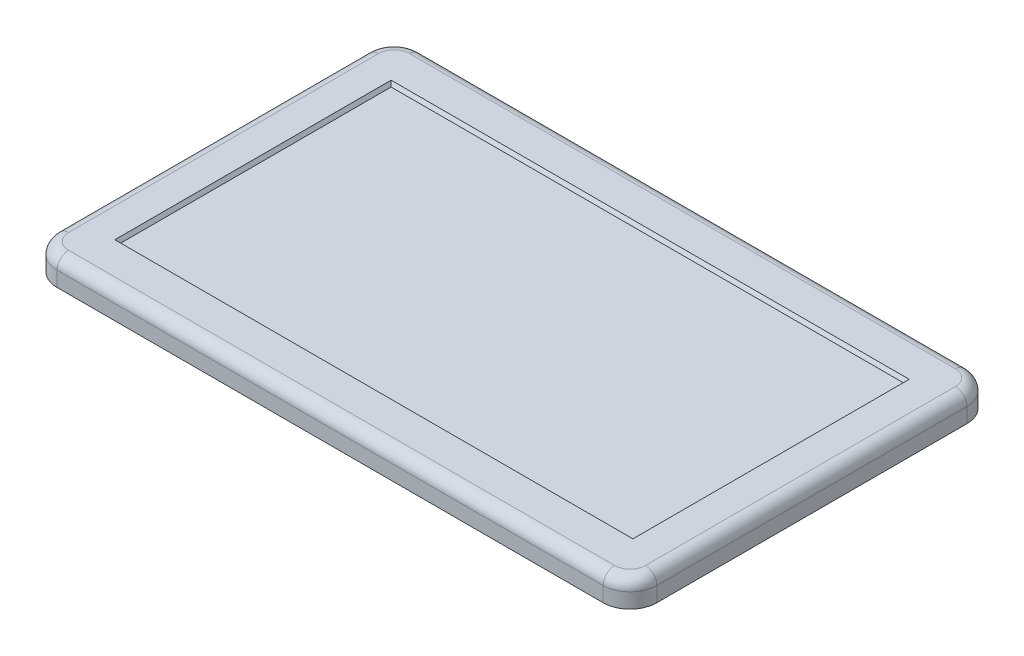
ISO-10303-21;
HEADER;
FILE_DESCRIPTION(('STEP AP214'),'2;1');
FILE_NAME('part.step','',(''),(''),'','','');
FILE_SCHEMA(('AUTOMOTIVE_DESIGN { 1 0 10303 214 1 1 1 1 }'));
ENDSEC;
DATA;
#1=APPLICATION_CONTEXT('core data for automotive mechanical design processes');
#2=APPLICATION_PROTOCOL_DEFINITION('international standard','automotive_design',2000,#1);
#3=PRODUCT_CONTEXT('',#1,'mechanical');
#4=PRODUCT('Part','Part','',(#3));
#5=PRODUCT_RELATED_PRODUCT_CATEGORY('part','',(#4));
#6=PRODUCT_DEFINITION_FORMATION('','',#4);
#7=PRODUCT_DEFINITION_CONTEXT('part definition',#1,'design');
#8=PRODUCT_DEFINITION('design','',#6,#7);
#9=PRODUCT_DEFINITION_SHAPE('','',#8);
#10=(LENGTH_UNIT() NAMED_UNIT(*) SI_UNIT(.MILLI.,.METRE.));
#11=(NAMED_UNIT(*) PLANE_ANGLE_UNIT() SI_UNIT($,.RADIAN.));
#12=(NAMED_UNIT(*) SI_UNIT($,.STERADIAN.) SOLID_ANGLE_UNIT());
#13=UNCERTAINTY_MEASURE_WITH_UNIT(LENGTH_MEASURE(1.E-05),#10,'distance_accuracy_value','');
#14=(GEOMETRIC_REPRESENTATION_CONTEXT(3) GLOBAL_UNCERTAINTY_ASSIGNED_CONTEXT((#13)) GLOBAL_UNIT_ASSIGNED_CONTEXT((#10,
#11,#12)) REPRESENTATION_CONTEXT('',''));
#15=CARTESIAN_POINT('',(0.,0.,0.));
#16=DIRECTION('',(0.,0.,1.));
#17=DIRECTION('',(1.,0.,0.));
#18=AXIS2_PLACEMENT_3D('',#15,#16,#17);
#19=CARTESIAN_POINT('',(148.6789,12.7,83.5914));
#20=DIRECTION('',(0.,1.,0.));
#21=DIRECTION('',(0.,0.,1.));
#22=AXIS2_PLACEMENT_3D('',#19,#20,#21);
#23=PLANE('',#22);
#24=CARTESIAN_POINT('',(148.6789,12.7,83.5914));
#25=DIRECTION('',(0.,-1.,0.));
#26=DIRECTION('',(0.,0.,1.));
#27=AXIS2_PLACEMENT_3D('',#24,#25,#26);
#28=CIRCLE('',#27,14.8336);
#29=CARTESIAN_POINT('',(163.5125,12.7,83.5914));
#30=VERTEX_POINT('',#29);
#31=CARTESIAN_POINT('',(148.6789,12.7,98.425));
#32=VERTEX_POINT('',#31);
#33=EDGE_CURVE('E399',#30,#32,#28,.T.);
#34=ORIENTED_EDGE('',*,*,#33,.T.);
#35=DIRECTION('',(-1.,0.,0.));
#36=VECTOR('',#35,1.);
#37=CARTESIAN_POINT('',(-148.6789,12.7,98.425));
#38=LINE('',#37,#36);
#39=CARTESIAN_POINT('',(-148.6789,12.7,98.425));
#40=VERTEX_POINT('',#39);
#41=EDGE_CURVE('E402',#32,#40,#38,.T.);
#42=ORIENTED_EDGE('',*,*,#41,.T.);
#43=CARTESIAN_POINT('',(-148.6789,12.7,83.5914));
#44=DIRECTION('',(0.,-1.,0.));
#45=DIRECTION('',(0.,0.,1.));
#46=AXIS2_PLACEMENT_3D('',#43,#44,#45);
#47=CIRCLE('',#46,14.8336);
#48=CARTESIAN_POINT('',(-163.5125,12.7,83.5914));
#49=VERTEX_POINT('',#48);
#50=EDGE_CURVE('E406',#40,#49,#47,.T.);
#51=ORIENTED_EDGE('',*,*,#50,.T.);
#52=DIRECTION('',(0.,0.,-1.));
#53=VECTOR('',#52,1.);
#54=CARTESIAN_POINT('',(-163.5125,12.7,-83.5914));
#55=LINE('',#54,#53);
#56=CARTESIAN_POINT('',(-163.5125,12.7,-83.5914));
#57=VERTEX_POINT('',#56);
#58=EDGE_CURVE('E409',#49,#57,#55,.T.);
#59=ORIENTED_EDGE('',*,*,#58,.T.);
#60=CARTESIAN_POINT('',(-148.6789,12.7,-83.5914));
#61=DIRECTION('',(0.,-1.,0.));
#62=DIRECTION('',(0.,0.,1.));
#63=AXIS2_PLACEMENT_3D('',#60,#61,#62);
#64=CIRCLE('',#63,14.8336);
#65=CARTESIAN_POINT('',(-148.6789,12.7,-98.425));
#66=VERTEX_POINT('',#65);
#67=EDGE_CURVE('E412',#57,#66,#64,.T.);
#68=ORIENTED_EDGE('',*,*,#67,.T.);
#69=DIRECTION('',(1.,0.,0.));
#70=VECTOR('',#69,1.);
#71=CARTESIAN_POINT('',(-148.6789,12.7,-98.425));
#72=LINE('',#71,#70);
#73=CARTESIAN_POINT('',(148.6789,12.7,-98.425));
#74=VERTEX_POINT('',#73);
#75=EDGE_CURVE('E415',#66,#74,#72,.T.);
#76=ORIENTED_EDGE('',*,*,#75,.T.);
#77=CARTESIAN_POINT('',(148.6789,12.7,-83.5914));
#78=DIRECTION('',(0.,-1.,0.));
#79=DIRECTION('',(0.,0.,1.));
#80=AXIS2_PLACEMENT_3D('',#77,#78,#79);
#81=CIRCLE('',#80,14.8336);
#82=CARTESIAN_POINT('',(163.5125,12.7,-83.5914));
#83=VERTEX_POINT('',#82);
#84=EDGE_CURVE('E418',#74,#83,#81,.T.);
#85=ORIENTED_EDGE('',*,*,#84,.T.);
#86=DIRECTION('',(0.,0.,1.));
#87=VECTOR('',#86,1.);
#88=CARTESIAN_POINT('',(163.5125,12.7,-83.5914));
#89=LINE('',#88,#87);
#90=EDGE_CURVE('E421',#83,#30,#89,.T.);
#91=ORIENTED_EDGE('',*,*,#90,.T.);
#92=EDGE_LOOP('',(#34,#42,#51,#59,#68,#76,#85,#91));
#93=FACE_BOUND('',#92,.T.);
#94=DIRECTION('',(0.,0.,1.));
#95=VECTOR('',#94,1.);
#96=CARTESIAN_POINT('',(145.366821734151,12.7,78.8489808004584));
#97=LINE('',#96,#95);
#98=CARTESIAN_POINT('',(145.366821734151,12.7,-78.8489808004584));
#99=VERTEX_POINT('',#98);
#100=CARTESIAN_POINT('',(145.366821734151,12.7,78.8489808004584));
#101=VERTEX_POINT('',#100);
#102=EDGE_CURVE('E225',#99,#101,#97,.T.);
#103=ORIENTED_EDGE('',*,*,#102,.F.);
#104=DIRECTION('',(1.,0.,0.));
#105=VECTOR('',#104,1.);
#106=CARTESIAN_POINT('',(-145.366821734151,12.7,-78.8489808004584));
#107=LINE('',#106,#105);
#108=CARTESIAN_POINT('',(-145.366821734151,12.7,-78.8489808004584));
#109=VERTEX_POINT('',#108);
#110=EDGE_CURVE('E227',#109,#99,#107,.T.);
#111=ORIENTED_EDGE('',*,*,#110,.F.);
#112=DIRECTION('',(0.,0.,-1.));
#113=VECTOR('',#112,1.);
#114=CARTESIAN_POINT('',(-145.366821734151,12.7,78.8489808004584));
#115=LINE('',#114,#113);
#116=CARTESIAN_POINT('',(-145.366821734151,12.7,78.8489808004584));
#117=VERTEX_POINT('',#116);
#118=EDGE_CURVE('E243',#117,#109,#115,.T.);
#119=ORIENTED_EDGE('',*,*,#118,.F.);
#120=DIRECTION('',(-1.,0.,0.));
#121=VECTOR('',#120,1.);
#122=CARTESIAN_POINT('',(-145.366821734151,12.7,78.8489808004584));
#123=LINE('',#122,#121);
#124=EDGE_CURVE('E229',#101,#117,#123,.T.);
#125=ORIENTED_EDGE('',*,*,#124,.F.);
#126=EDGE_LOOP('',(#103,#111,#119,#125));
#127=FACE_BOUND('',#126,.T.);
#128=ADVANCED_FACE('F40',(#93,#127),#23,.F.);
#129=CARTESIAN_POINT('',(150.5839,14.605,85.4964));
#130=DIRECTION('',(0.,1.,0.));
#131=DIRECTION('',(0.,0.,1.));
#132=AXIS2_PLACEMENT_3D('',#129,#130,#131);
#133=PLANE('',#132);
#134=DIRECTION('',(0.,0.,1.));
#135=VECTOR('',#134,1.);
#136=CARTESIAN_POINT('',(-159.0675,14.605,85.4964));
#137=LINE('',#136,#135);
#138=CARTESIAN_POINT('',(-159.0675,14.605,-85.4964));
#139=VERTEX_POINT('',#138);
#140=CARTESIAN_POINT('',(-159.0675,14.605,85.4964));
#141=VERTEX_POINT('',#140);
#142=EDGE_CURVE('E517',#139,#141,#137,.T.);
#143=ORIENTED_EDGE('',*,*,#142,.T.);
#144=CARTESIAN_POINT('',(-150.5839,14.605,85.4964));
#145=DIRECTION('',(0.,1.,0.));
#146=DIRECTION('',(0.,0.,1.));
#147=AXIS2_PLACEMENT_3D('',#144,#145,#146);
#148=CIRCLE('',#147,8.4836);
#149=CARTESIAN_POINT('',(-150.5839,14.605,93.98));
#150=VERTEX_POINT('',#149);
#151=EDGE_CURVE('E519',#141,#150,#148,.T.);
#152=ORIENTED_EDGE('',*,*,#151,.T.);
#153=DIRECTION('',(1.,0.,0.));
#154=VECTOR('',#153,1.);
#155=CARTESIAN_POINT('',(150.5839,14.605,93.98));
#156=LINE('',#155,#154);
#157=CARTESIAN_POINT('',(150.5839,14.605,93.98));
#158=VERTEX_POINT('',#157);
#159=EDGE_CURVE('E505',#150,#158,#156,.T.);
#160=ORIENTED_EDGE('',*,*,#159,.T.);
#161=CARTESIAN_POINT('',(150.5839,14.605,85.4964));
#162=DIRECTION('',(0.,1.,0.));
#163=DIRECTION('',(0.,0.,1.));
#164=AXIS2_PLACEMENT_3D('',#161,#162,#163);
#165=CIRCLE('',#164,8.4836);
#166=CARTESIAN_POINT('',(159.0675,14.605,85.4964));
#167=VERTEX_POINT('',#166);
#168=EDGE_CURVE('E507',#158,#167,#165,.T.);
#169=ORIENTED_EDGE('',*,*,#168,.T.);
#170=DIRECTION('',(0.,0.,-1.));
#171=VECTOR('',#170,1.);
#172=CARTESIAN_POINT('',(159.0675,14.605,-85.4964));
#173=LINE('',#172,#171);
#174=CARTESIAN_POINT('',(159.0675,14.605,-85.4964));
#175=VERTEX_POINT('',#174);
#176=EDGE_CURVE('E509',#167,#175,#173,.T.);
#177=ORIENTED_EDGE('',*,*,#176,.T.);
#178=CARTESIAN_POINT('',(150.5839,14.605,-85.4964));
#179=DIRECTION('',(0.,1.,0.));
#180=DIRECTION('',(0.,0.,1.));
#181=AXIS2_PLACEMENT_3D('',#178,#179,#180);
#182=CIRCLE('',#181,8.4836);
#183=CARTESIAN_POINT('',(150.5839,14.605,-93.98));
#184=VERTEX_POINT('',#183);
#185=EDGE_CURVE('E511',#175,#184,#182,.T.);
#186=ORIENTED_EDGE('',*,*,#185,.T.);
#187=DIRECTION('',(-1.,0.,0.));
#188=VECTOR('',#187,1.);
#189=CARTESIAN_POINT('',(-150.5839,14.605,-93.98));
#190=LINE('',#189,#188);
#191=CARTESIAN_POINT('',(-150.5839,14.605,-93.98));
#192=VERTEX_POINT('',#191);
#193=EDGE_CURVE('E513',#184,#192,#190,.T.);
#194=ORIENTED_EDGE('',*,*,#193,.T.);
#195=CARTESIAN_POINT('',(-150.5839,14.605,-85.4964));
#196=DIRECTION('',(0.,1.,0.));
#197=DIRECTION('',(0.,0.,1.));
#198=AXIS2_PLACEMENT_3D('',#195,#196,#197);
#199=CIRCLE('',#198,8.4836);
#200=EDGE_CURVE('E515',#192,#139,#199,.T.);
#201=ORIENTED_EDGE('',*,*,#200,.T.);
#202=EDGE_LOOP('',(#143,#152,#160,#169,#177,#186,#194,#201));
#203=FACE_BOUND('',#202,.T.);
#204=DIRECTION('',(1.,0.,0.));
#205=VECTOR('',#204,1.);
#206=CARTESIAN_POINT('',(-142.875,14.605,76.2));
#207=LINE('',#206,#205);
#208=CARTESIAN_POINT('',(-142.875,14.605,76.2));
#209=VERTEX_POINT('',#208);
#210=CARTESIAN_POINT('',(142.875,14.605,76.2));
#211=VERTEX_POINT('',#210);
#212=EDGE_CURVE('E263',#209,#211,#207,.T.);
#213=ORIENTED_EDGE('',*,*,#212,.F.);
#214=DIRECTION('',(0.,0.,1.));
#215=VECTOR('',#214,1.);
#216=CARTESIAN_POINT('',(-142.875,14.605,76.2));
#217=LINE('',#216,#215);
#218=CARTESIAN_POINT('',(-142.875,14.605,-76.1999999999999));
#219=VERTEX_POINT('',#218);
#220=EDGE_CURVE('E330',#219,#209,#217,.T.);
#221=ORIENTED_EDGE('',*,*,#220,.F.);
#222=DIRECTION('',(-1.,0.,0.));
#223=VECTOR('',#222,1.);
#224=CARTESIAN_POINT('',(-142.875,14.605,-76.2));
#225=LINE('',#224,#223);
#226=CARTESIAN_POINT('',(142.875,14.605,-76.2));
#227=VERTEX_POINT('',#226);
#228=EDGE_CURVE('E331',#227,#219,#225,.T.);
#229=ORIENTED_EDGE('',*,*,#228,.F.);
#230=DIRECTION('',(0.,0.,-1.));
#231=VECTOR('',#230,1.);
#232=CARTESIAN_POINT('',(142.875,14.605,76.2));
#233=LINE('',#232,#231);
#234=EDGE_CURVE('E242',#211,#227,#233,.T.);
#235=ORIENTED_EDGE('',*,*,#234,.F.);
#236=EDGE_LOOP('',(#213,#221,#229,#235));
#237=FACE_BOUND('',#236,.T.);
#238=ADVANCED_FACE('F356',(#203,#237),#133,.T.);
#239=CARTESIAN_POINT('',(150.5839,14.605,85.4964));
#240=DIRECTION('',(0.,-1.,0.));
#241=DIRECTION('',(0.,0.,-1.));
#242=AXIS2_PLACEMENT_3D('',#239,#240,#241);
#243=CYLINDRICAL_SURFACE('',#242,14.8336);
#244=DIRECTION('',(0.,-1.,0.));
#245=VECTOR('',#244,1.);
#246=CARTESIAN_POINT('',(165.4175,14.605,85.4964));
#247=LINE('',#246,#245);
#248=CARTESIAN_POINT('',(165.4175,8.255,85.4964));
#249=VERTEX_POINT('',#248);
#250=CARTESIAN_POINT('',(165.4175,0.,85.4964));
#251=VERTEX_POINT('',#250);
#252=EDGE_CURVE('E503',#249,#251,#247,.T.);
#253=ORIENTED_EDGE('',*,*,#252,.F.);
#254=CARTESIAN_POINT('',(150.5839,8.255,85.4964));
#255=DIRECTION('',(0.,1.,0.));
#256=DIRECTION('',(0.,0.,1.));
#257=AXIS2_PLACEMENT_3D('',#254,#255,#256);
#258=CIRCLE('',#257,14.8336);
#259=CARTESIAN_POINT('',(150.5839,8.255,100.33));
#260=VERTEX_POINT('',#259);
#261=EDGE_CURVE('E535',#249,#260,#258,.F.);
#262=ORIENTED_EDGE('',*,*,#261,.T.);
#263=DIRECTION('',(0.,-1.,0.));
#264=VECTOR('',#263,1.);
#265=CARTESIAN_POINT('',(150.5839,14.605,100.33));
#266=LINE('',#265,#264);
#267=CARTESIAN_POINT('',(150.5839,0.,100.33));
#268=VERTEX_POINT('',#267);
#269=EDGE_CURVE('E489',#260,#268,#266,.T.);
#270=ORIENTED_EDGE('',*,*,#269,.T.);
#271=CARTESIAN_POINT('',(150.5839,0.,85.4964));
#272=DIRECTION('',(0.,1.,0.));
#273=DIRECTION('',(0.,0.,1.));
#274=AXIS2_PLACEMENT_3D('',#271,#272,#273);
#275=CIRCLE('',#274,14.8336);
#276=EDGE_CURVE('E464',#268,#251,#275,.T.);
#277=ORIENTED_EDGE('',*,*,#276,.T.);
#278=EDGE_LOOP('',(#253,#262,#270,#277));
#279=FACE_BOUND('',#278,.T.);
#280=ADVANCED_FACE('F366',(#279),#243,.T.);
#281=CARTESIAN_POINT('',(165.4175,14.605,85.4964));
#282=DIRECTION('',(-1.,0.,0.));
#283=DIRECTION('',(0.,0.,1.));
#284=AXIS2_PLACEMENT_3D('',#281,#282,#283);
#285=PLANE('',#284);
#286=DIRECTION('',(0.,-1.,0.));
#287=VECTOR('',#286,1.);
#288=CARTESIAN_POINT('',(165.4175,14.605,-85.4964));
#289=LINE('',#288,#287);
#290=CARTESIAN_POINT('',(165.4175,8.255,-85.4964));
#291=VERTEX_POINT('',#290);
#292=CARTESIAN_POINT('',(165.4175,0.,-85.4964));
#293=VERTEX_POINT('',#292);
#294=EDGE_CURVE('E501',#291,#293,#289,.T.);
#295=ORIENTED_EDGE('',*,*,#294,.F.);
#296=DIRECTION('',(0.,0.,-1.));
#297=VECTOR('',#296,1.);
#298=CARTESIAN_POINT('',(165.4175,8.255,85.4964));
#299=LINE('',#298,#297);
#300=EDGE_CURVE('E533',#291,#249,#299,.F.);
#301=ORIENTED_EDGE('',*,*,#300,.T.);
#302=ORIENTED_EDGE('',*,*,#252,.T.);
#303=DIRECTION('',(0.,0.,-1.));
#304=VECTOR('',#303,1.);
#305=CARTESIAN_POINT('',(165.4175,0.,85.4964));
#306=LINE('',#305,#304);
#307=EDGE_CURVE('E467',#251,#293,#306,.T.);
#308=ORIENTED_EDGE('',*,*,#307,.T.);
#309=EDGE_LOOP('',(#295,#301,#302,#308));
#310=FACE_BOUND('',#309,.T.);
#311=ADVANCED_FACE('F845',(#310),#285,.F.);
#312=CARTESIAN_POINT('',(150.5839,14.605,-85.4964));
#313=DIRECTION('',(0.,-1.,0.));
#314=DIRECTION('',(0.,0.,-1.));
#315=AXIS2_PLACEMENT_3D('',#312,#313,#314);
#316=CYLINDRICAL_SURFACE('',#315,14.8336);
#317=DIRECTION('',(0.,-1.,0.));
#318=VECTOR('',#317,1.);
#319=CARTESIAN_POINT('',(150.5839,14.605,-100.33));
#320=LINE('',#319,#318);
#321=CARTESIAN_POINT('',(150.5839,8.255,-100.33));
#322=VERTEX_POINT('',#321);
#323=CARTESIAN_POINT('',(150.5839,0.,-100.33));
#324=VERTEX_POINT('',#323);
#325=EDGE_CURVE('E499',#322,#324,#320,.T.);
#326=ORIENTED_EDGE('',*,*,#325,.F.);
#327=CARTESIAN_POINT('',(150.5839,8.255,-85.4964));
#328=DIRECTION('',(0.,1.,0.));
#329=DIRECTION('',(0.,0.,1.));
#330=AXIS2_PLACEMENT_3D('',#327,#328,#329);
#331=CIRCLE('',#330,14.8336);
#332=EDGE_CURVE('E531',#322,#291,#331,.F.);
#333=ORIENTED_EDGE('',*,*,#332,.T.);
#334=ORIENTED_EDGE('',*,*,#294,.T.);
#335=CARTESIAN_POINT('',(150.5839,0.,-85.4964));
#336=DIRECTION('',(0.,1.,0.));
#337=DIRECTION('',(0.,0.,1.));
#338=AXIS2_PLACEMENT_3D('',#335,#336,#337);
#339=CIRCLE('',#338,14.8336);
#340=EDGE_CURVE('E471',#293,#324,#339,.T.);
#341=ORIENTED_EDGE('',*,*,#340,.T.);
#342=EDGE_LOOP('',(#326,#333,#334,#341));
#343=FACE_BOUND('',#342,.T.);
#344=ADVANCED_FACE('F836',(#343),#316,.T.);
#345=CARTESIAN_POINT('',(-150.5839,14.605,-100.33));
#346=DIRECTION('',(0.,0.,1.));
#347=DIRECTION('',(1.,0.,0.));
#348=AXIS2_PLACEMENT_3D('',#345,#346,#347);
#349=PLANE('',#348);
#350=DIRECTION('',(0.,-1.,0.));
#351=VECTOR('',#350,1.);
#352=CARTESIAN_POINT('',(-150.5839,14.605,-100.33));
#353=LINE('',#352,#351);
#354=CARTESIAN_POINT('',(-150.5839,8.255,-100.33));
#355=VERTEX_POINT('',#354);
#356=CARTESIAN_POINT('',(-150.5839,0.,-100.33));
#357=VERTEX_POINT('',#356);
#358=EDGE_CURVE('E497',#355,#357,#353,.T.);
#359=ORIENTED_EDGE('',*,*,#358,.F.);
#360=DIRECTION('',(-1.,0.,0.));
#361=VECTOR('',#360,1.);
#362=CARTESIAN_POINT('',(150.5839,8.255,-100.33));
#363=LINE('',#362,#361);
#364=EDGE_CURVE('E529',#355,#322,#363,.F.);
#365=ORIENTED_EDGE('',*,*,#364,.T.);
#366=ORIENTED_EDGE('',*,*,#325,.T.);
#367=DIRECTION('',(-1.,0.,0.));
#368=VECTOR('',#367,1.);
#369=CARTESIAN_POINT('',(-150.5839,0.,-100.33));
#370=LINE('',#369,#368);
#371=EDGE_CURVE('E474',#324,#357,#370,.T.);
#372=ORIENTED_EDGE('',*,*,#371,.T.);
#373=EDGE_LOOP('',(#359,#365,#366,#372));
#374=FACE_BOUND('',#373,.T.);
#375=ADVANCED_FACE('F827',(#374),#349,.F.);
#376=CARTESIAN_POINT('',(-150.5839,14.605,-85.4964));
#377=DIRECTION('',(0.,-1.,0.));
#378=DIRECTION('',(0.,0.,-1.));
#379=AXIS2_PLACEMENT_3D('',#376,#377,#378);
#380=CYLINDRICAL_SURFACE('',#379,14.8336);
#381=DIRECTION('',(0.,-1.,0.));
#382=VECTOR('',#381,1.);
#383=CARTESIAN_POINT('',(-165.4175,14.605,-85.4964));
#384=LINE('',#383,#382);
#385=CARTESIAN_POINT('',(-165.4175,8.255,-85.4964));
#386=VERTEX_POINT('',#385);
#387=CARTESIAN_POINT('',(-165.4175,0.,-85.4964));
#388=VERTEX_POINT('',#387);
#389=EDGE_CURVE('E495',#386,#388,#384,.T.);
#390=ORIENTED_EDGE('',*,*,#389,.F.);
#391=CARTESIAN_POINT('',(-150.5839,8.255,-85.4964));
#392=DIRECTION('',(0.,1.,0.));
#393=DIRECTION('',(0.,0.,1.));
#394=AXIS2_PLACEMENT_3D('',#391,#392,#393);
#395=CIRCLE('',#394,14.8336);
#396=EDGE_CURVE('E527',#386,#355,#395,.F.);
#397=ORIENTED_EDGE('',*,*,#396,.T.);
#398=ORIENTED_EDGE('',*,*,#358,.T.);
#399=CARTESIAN_POINT('',(-150.5839,0.,-85.4964));
#400=DIRECTION('',(0.,1.,0.));
#401=DIRECTION('',(0.,0.,1.));
#402=AXIS2_PLACEMENT_3D('',#399,#400,#401);
#403=CIRCLE('',#402,14.8336);
#404=EDGE_CURVE('E477',#357,#388,#403,.T.);
#405=ORIENTED_EDGE('',*,*,#404,.T.);
#406=EDGE_LOOP('',(#390,#397,#398,#405));
#407=FACE_BOUND('',#406,.T.);
#408=ADVANCED_FACE('F818',(#407),#380,.T.);
#409=CARTESIAN_POINT('',(-165.4175,14.605,85.4964));
#410=DIRECTION('',(1.,0.,0.));
#411=DIRECTION('',(0.,0.,-1.));
#412=AXIS2_PLACEMENT_3D('',#409,#410,#411);
#413=PLANE('',#412);
#414=DIRECTION('',(0.,-1.,0.));
#415=VECTOR('',#414,1.);
#416=CARTESIAN_POINT('',(-165.4175,14.605,85.4964));
#417=LINE('',#416,#415);
#418=CARTESIAN_POINT('',(-165.4175,8.255,85.4964));
#419=VERTEX_POINT('',#418);
#420=CARTESIAN_POINT('',(-165.4175,0.,85.4964));
#421=VERTEX_POINT('',#420);
#422=EDGE_CURVE('E493',#419,#421,#417,.T.);
#423=ORIENTED_EDGE('',*,*,#422,.F.);
#424=DIRECTION('',(0.,0.,1.));
#425=VECTOR('',#424,1.);
#426=CARTESIAN_POINT('',(-165.4175,8.255,-85.4964));
#427=LINE('',#426,#425);
#428=EDGE_CURVE('E525',#419,#386,#427,.F.);
#429=ORIENTED_EDGE('',*,*,#428,.T.);
#430=ORIENTED_EDGE('',*,*,#389,.T.);
#431=DIRECTION('',(0.,0.,1.));
#432=VECTOR('',#431,1.);
#433=CARTESIAN_POINT('',(-165.4175,0.,85.4964));
#434=LINE('',#433,#432);
#435=EDGE_CURVE('E480',#388,#421,#434,.T.);
#436=ORIENTED_EDGE('',*,*,#435,.T.);
#437=EDGE_LOOP('',(#423,#429,#430,#436));
#438=FACE_BOUND('',#437,.T.);
#439=ADVANCED_FACE('F809',(#438),#413,.F.);
#440=CARTESIAN_POINT('',(-150.5839,14.605,85.4964));
#441=DIRECTION('',(0.,-1.,0.));
#442=DIRECTION('',(0.,0.,-1.));
#443=AXIS2_PLACEMENT_3D('',#440,#441,#442);
#444=CYLINDRICAL_SURFACE('',#443,14.8336);
#445=DIRECTION('',(0.,-1.,0.));
#446=VECTOR('',#445,1.);
#447=CARTESIAN_POINT('',(-150.5839,14.605,100.33));
#448=LINE('',#447,#446);
#449=CARTESIAN_POINT('',(-150.5839,8.255,100.33));
#450=VERTEX_POINT('',#449);
#451=CARTESIAN_POINT('',(-150.5839,0.,100.33));
#452=VERTEX_POINT('',#451);
#453=EDGE_CURVE('E491',#450,#452,#448,.T.);
#454=ORIENTED_EDGE('',*,*,#453,.F.);
#455=CARTESIAN_POINT('',(-150.5839,8.255,85.4964));
#456=DIRECTION('',(0.,1.,0.));
#457=DIRECTION('',(0.,0.,1.));
#458=AXIS2_PLACEMENT_3D('',#455,#456,#457);
#459=CIRCLE('',#458,14.8336);
#460=EDGE_CURVE('E522',#450,#419,#459,.F.);
#461=ORIENTED_EDGE('',*,*,#460,.T.);
#462=ORIENTED_EDGE('',*,*,#422,.T.);
#463=CARTESIAN_POINT('',(-150.5839,0.,85.4964));
#464=DIRECTION('',(0.,1.,0.));
#465=DIRECTION('',(0.,0.,-1.));
#466=AXIS2_PLACEMENT_3D('',#463,#464,#465);
#467=CIRCLE('',#466,14.8336);
#468=EDGE_CURVE('E483',#421,#452,#467,.T.);
#469=ORIENTED_EDGE('',*,*,#468,.T.);
#470=EDGE_LOOP('',(#454,#461,#462,#469));
#471=FACE_BOUND('',#470,.T.);
#472=ADVANCED_FACE('F801',(#471),#444,.T.);
#473=CARTESIAN_POINT('',(-150.5839,14.605,100.33));
#474=DIRECTION('',(0.,0.,-1.));
#475=DIRECTION('',(-1.,0.,0.));
#476=AXIS2_PLACEMENT_3D('',#473,#474,#475);
#477=PLANE('',#476);
#478=ORIENTED_EDGE('',*,*,#269,.F.);
#479=DIRECTION('',(1.,0.,0.));
#480=VECTOR('',#479,1.);
#481=CARTESIAN_POINT('',(-150.5839,8.255,100.33));
#482=LINE('',#481,#480);
#483=EDGE_CURVE('E537',#260,#450,#482,.F.);
#484=ORIENTED_EDGE('',*,*,#483,.T.);
#485=ORIENTED_EDGE('',*,*,#453,.T.);
#486=DIRECTION('',(1.,0.,0.));
#487=VECTOR('',#486,1.);
#488=CARTESIAN_POINT('',(-150.5839,0.,100.33));
#489=LINE('',#488,#487);
#490=EDGE_CURVE('E486',#452,#268,#489,.T.);
#491=ORIENTED_EDGE('',*,*,#490,.T.);
#492=EDGE_LOOP('',(#478,#484,#485,#491));
#493=FACE_BOUND('',#492,.T.);
#494=ADVANCED_FACE('F795',(#493),#477,.F.);
#495=CARTESIAN_POINT('',(150.5839,0.,85.4964));
#496=DIRECTION('',(0.,1.,0.));
#497=DIRECTION('',(0.,0.,1.));
#498=AXIS2_PLACEMENT_3D('',#495,#496,#497);
#499=PLANE('',#498);
#500=DIRECTION('',(-1.,0.,0.));
#501=VECTOR('',#500,1.);
#502=CARTESIAN_POINT('',(-148.6789,0.,98.425));
#503=LINE('',#502,#501);
#504=CARTESIAN_POINT('',(148.6789,0.,98.425));
#505=VERTEX_POINT('',#504);
#506=CARTESIAN_POINT('',(-148.6789,0.,98.425));
#507=VERTEX_POINT('',#506);
#508=EDGE_CURVE('E427',#505,#507,#503,.T.);
#509=ORIENTED_EDGE('',*,*,#508,.F.);
#510=CARTESIAN_POINT('',(148.6789,0.,83.5914));
#511=DIRECTION('',(0.,-1.,0.));
#512=DIRECTION('',(0.,0.,1.));
#513=AXIS2_PLACEMENT_3D('',#510,#511,#512);
#514=CIRCLE('',#513,14.8336);
#515=CARTESIAN_POINT('',(163.5125,0.,83.5914));
#516=VERTEX_POINT('',#515);
#517=EDGE_CURVE('E425',#516,#505,#514,.T.);
#518=ORIENTED_EDGE('',*,*,#517,.F.);
#519=DIRECTION('',(0.,0.,1.));
#520=VECTOR('',#519,1.);
#521=CARTESIAN_POINT('',(163.5125,0.,-83.5914));
#522=LINE('',#521,#520);
#523=CARTESIAN_POINT('',(163.5125,0.,-83.5914));
#524=VERTEX_POINT('',#523);
#525=EDGE_CURVE('E403',#524,#516,#522,.T.);
#526=ORIENTED_EDGE('',*,*,#525,.F.);
#527=CARTESIAN_POINT('',(148.6789,0.,-83.5914));
#528=DIRECTION('',(0.,-1.,0.));
#529=DIRECTION('',(0.,0.,1.));
#530=AXIS2_PLACEMENT_3D('',#527,#528,#529);
#531=CIRCLE('',#530,14.8336);
#532=CARTESIAN_POINT('',(148.6789,0.,-98.425));
#533=VERTEX_POINT('',#532);
#534=EDGE_CURVE('E442',#533,#524,#531,.T.);
#535=ORIENTED_EDGE('',*,*,#534,.F.);
#536=DIRECTION('',(1.,0.,0.));
#537=VECTOR('',#536,1.);
#538=CARTESIAN_POINT('',(-148.6789,0.,-98.425));
#539=LINE('',#538,#537);
#540=CARTESIAN_POINT('',(-148.6789,0.,-98.425));
#541=VERTEX_POINT('',#540);
#542=EDGE_CURVE('E439',#541,#533,#539,.T.);
#543=ORIENTED_EDGE('',*,*,#542,.F.);
#544=CARTESIAN_POINT('',(-148.6789,0.,-83.5914));
#545=DIRECTION('',(0.,-1.,0.));
#546=DIRECTION('',(0.,0.,1.));
#547=AXIS2_PLACEMENT_3D('',#544,#545,#546);
#548=CIRCLE('',#547,14.8336);
#549=CARTESIAN_POINT('',(-163.5125,0.,-83.5914));
#550=VERTEX_POINT('',#549);
#551=EDGE_CURVE('E436',#550,#541,#548,.T.);
#552=ORIENTED_EDGE('',*,*,#551,.F.);
#553=DIRECTION('',(0.,0.,-1.));
#554=VECTOR('',#553,1.);
#555=CARTESIAN_POINT('',(-163.5125,0.,-83.5914));
#556=LINE('',#555,#554);
#557=CARTESIAN_POINT('',(-163.5125,0.,83.5914));
#558=VERTEX_POINT('',#557);
#559=EDGE_CURVE('E433',#558,#550,#556,.T.);
#560=ORIENTED_EDGE('',*,*,#559,.F.);
#561=CARTESIAN_POINT('',(-148.6789,0.,83.5914));
#562=DIRECTION('',(0.,-1.,0.));
#563=DIRECTION('',(0.,0.,1.));
#564=AXIS2_PLACEMENT_3D('',#561,#562,#563);
#565=CIRCLE('',#564,14.8336);
#566=EDGE_CURVE('E430',#507,#558,#565,.T.);
#567=ORIENTED_EDGE('',*,*,#566,.F.);
#568=EDGE_LOOP('',(#509,#518,#526,#535,#543,#552,#560,#567));
#569=FACE_BOUND('',#568,.T.);
#570=ORIENTED_EDGE('',*,*,#276,.F.);
#571=ORIENTED_EDGE('',*,*,#490,.F.);
#572=ORIENTED_EDGE('',*,*,#468,.F.);
#573=ORIENTED_EDGE('',*,*,#435,.F.);
#574=ORIENTED_EDGE('',*,*,#404,.F.);
#575=ORIENTED_EDGE('',*,*,#371,.F.);
#576=ORIENTED_EDGE('',*,*,#340,.F.);
#577=ORIENTED_EDGE('',*,*,#307,.F.);
#578=EDGE_LOOP('',(#570,#571,#572,#573,#574,#575,#576,#577));
#579=FACE_BOUND('',#578,.T.);
#580=ADVANCED_FACE('F370',(#569,#579),#499,.F.);
#581=CARTESIAN_POINT('',(150.5839,8.255,-85.4964));
#582=DIRECTION('',(0.,1.,0.));
#583=DIRECTION('',(0.,0.,1.));
#584=AXIS2_PLACEMENT_3D('',#581,#582,#583);
#585=TOROIDAL_SURFACE('',#584,8.4836,6.35);
#586=CARTESIAN_POINT('',(159.0675,8.255,-85.4964));
#587=DIRECTION('',(0.,0.,1.));
#588=DIRECTION('',(1.,0.,0.));
#589=AXIS2_PLACEMENT_3D('',#586,#587,#588);
#590=CIRCLE('',#589,6.35);
#591=EDGE_CURVE('E555',#291,#175,#590,.T.);
#592=ORIENTED_EDGE('',*,*,#591,.F.);
#593=ORIENTED_EDGE('',*,*,#332,.F.);
#594=CARTESIAN_POINT('',(150.5839,8.255,-93.98));
#595=DIRECTION('',(-1.,0.,0.));
#596=DIRECTION('',(0.,0.,1.));
#597=AXIS2_PLACEMENT_3D('',#594,#595,#596);
#598=CIRCLE('',#597,6.35);
#599=EDGE_CURVE('E468',#184,#322,#598,.T.);
#600=ORIENTED_EDGE('',*,*,#599,.F.);
#601=ORIENTED_EDGE('',*,*,#185,.F.);
#602=EDGE_LOOP('',(#592,#593,#600,#601));
#603=FACE_BOUND('',#602,.T.);
#604=ADVANCED_FACE('F657',(#603),#585,.T.);
#605=CARTESIAN_POINT('',(150.5839,8.255,-93.98));
#606=DIRECTION('',(1.,0.,0.));
#607=DIRECTION('',(0.,0.,-1.));
#608=AXIS2_PLACEMENT_3D('',#605,#606,#607);
#609=CYLINDRICAL_SURFACE('',#608,6.35);
#610=ORIENTED_EDGE('',*,*,#599,.T.);
#611=ORIENTED_EDGE('',*,*,#364,.F.);
#612=CARTESIAN_POINT('',(-150.5839,8.255,-93.98));
#613=DIRECTION('',(-1.,0.,0.));
#614=DIRECTION('',(0.,0.,1.));
#615=AXIS2_PLACEMENT_3D('',#612,#613,#614);
#616=CIRCLE('',#615,6.35);
#617=EDGE_CURVE('E552',#192,#355,#616,.T.);
#618=ORIENTED_EDGE('',*,*,#617,.F.);
#619=ORIENTED_EDGE('',*,*,#193,.F.);
#620=EDGE_LOOP('',(#610,#611,#618,#619));
#621=FACE_BOUND('',#620,.T.);
#622=ADVANCED_FACE('F653',(#621),#609,.T.);
#623=CARTESIAN_POINT('',(159.0675,8.255,85.4964));
#624=DIRECTION('',(0.,0.,1.));
#625=DIRECTION('',(1.,0.,0.));
#626=AXIS2_PLACEMENT_3D('',#623,#624,#625);
#627=CYLINDRICAL_SURFACE('',#626,6.35);
#628=ORIENTED_EDGE('',*,*,#591,.T.);
#629=ORIENTED_EDGE('',*,*,#176,.F.);
#630=CARTESIAN_POINT('',(159.0675,8.255,85.4964));
#631=DIRECTION('',(0.,0.,1.));
#632=DIRECTION('',(1.,0.,0.));
#633=AXIS2_PLACEMENT_3D('',#630,#631,#632);
#634=CIRCLE('',#633,6.35);
#635=EDGE_CURVE('E549',#249,#167,#634,.T.);
#636=ORIENTED_EDGE('',*,*,#635,.F.);
#637=ORIENTED_EDGE('',*,*,#300,.F.);
#638=EDGE_LOOP('',(#628,#629,#636,#637));
#639=FACE_BOUND('',#638,.T.);
#640=ADVANCED_FACE('F649',(#639),#627,.T.);
#641=CARTESIAN_POINT('',(-150.5839,8.255,-85.4964));
#642=DIRECTION('',(0.,1.,0.));
#643=DIRECTION('',(0.,0.,1.));
#644=AXIS2_PLACEMENT_3D('',#641,#642,#643);
#645=TOROIDAL_SURFACE('',#644,8.4836,6.35);
#646=ORIENTED_EDGE('',*,*,#617,.T.);
#647=ORIENTED_EDGE('',*,*,#396,.F.);
#648=CARTESIAN_POINT('',(-159.0675,8.255,-85.4964));
#649=DIRECTION('',(0.,0.,1.));
#650=DIRECTION('',(1.,0.,0.));
#651=AXIS2_PLACEMENT_3D('',#648,#649,#650);
#652=CIRCLE('',#651,6.35);
#653=EDGE_CURVE('E546',#139,#386,#652,.T.);
#654=ORIENTED_EDGE('',*,*,#653,.F.);
#655=ORIENTED_EDGE('',*,*,#200,.F.);
#656=EDGE_LOOP('',(#646,#647,#654,#655));
#657=FACE_BOUND('',#656,.T.);
#658=ADVANCED_FACE('F645',(#657),#645,.T.);
#659=CARTESIAN_POINT('',(150.5839,8.255,85.4964));
#660=DIRECTION('',(0.,1.,0.));
#661=DIRECTION('',(0.,0.,1.));
#662=AXIS2_PLACEMENT_3D('',#659,#660,#661);
#663=TOROIDAL_SURFACE('',#662,8.4836,6.35);
#664=ORIENTED_EDGE('',*,*,#635,.T.);
#665=ORIENTED_EDGE('',*,*,#168,.F.);
#666=CARTESIAN_POINT('',(150.5839,8.255,93.98));
#667=DIRECTION('',(-1.,0.,0.));
#668=DIRECTION('',(0.,0.,1.));
#669=AXIS2_PLACEMENT_3D('',#666,#667,#668);
#670=CIRCLE('',#669,6.35);
#671=EDGE_CURVE('E543',#260,#158,#670,.T.);
#672=ORIENTED_EDGE('',*,*,#671,.F.);
#673=ORIENTED_EDGE('',*,*,#261,.F.);
#674=EDGE_LOOP('',(#664,#665,#672,#673));
#675=FACE_BOUND('',#674,.T.);
#676=ADVANCED_FACE('F641',(#675),#663,.T.);
#677=CARTESIAN_POINT('',(-159.0675,8.255,85.4964));
#678=DIRECTION('',(0.,0.,-1.));
#679=DIRECTION('',(-1.,0.,0.));
#680=AXIS2_PLACEMENT_3D('',#677,#678,#679);
#681=CYLINDRICAL_SURFACE('',#680,6.35);
#682=ORIENTED_EDGE('',*,*,#653,.T.);
#683=ORIENTED_EDGE('',*,*,#428,.F.);
#684=CARTESIAN_POINT('',(-159.0675,8.255,85.4964));
#685=DIRECTION('',(0.,0.,1.));
#686=DIRECTION('',(1.,0.,0.));
#687=AXIS2_PLACEMENT_3D('',#684,#685,#686);
#688=CIRCLE('',#687,6.35);
#689=EDGE_CURVE('E541',#141,#419,#688,.T.);
#690=ORIENTED_EDGE('',*,*,#689,.F.);
#691=ORIENTED_EDGE('',*,*,#142,.F.);
#692=EDGE_LOOP('',(#682,#683,#690,#691));
#693=FACE_BOUND('',#692,.T.);
#694=ADVANCED_FACE('F633',(#693),#681,.T.);
#695=CARTESIAN_POINT('',(150.5839,8.255,93.98));
#696=DIRECTION('',(-1.,0.,0.));
#697=DIRECTION('',(0.,0.,1.));
#698=AXIS2_PLACEMENT_3D('',#695,#696,#697);
#699=CYLINDRICAL_SURFACE('',#698,6.35);
#700=ORIENTED_EDGE('',*,*,#671,.T.);
#701=ORIENTED_EDGE('',*,*,#159,.F.);
#702=CARTESIAN_POINT('',(-150.5839,8.255,93.98));
#703=DIRECTION('',(-1.,0.,0.));
#704=DIRECTION('',(0.,0.,1.));
#705=AXIS2_PLACEMENT_3D('',#702,#703,#704);
#706=CIRCLE('',#705,6.35);
#707=EDGE_CURVE('E449',#450,#150,#706,.T.);
#708=ORIENTED_EDGE('',*,*,#707,.F.);
#709=ORIENTED_EDGE('',*,*,#483,.F.);
#710=EDGE_LOOP('',(#700,#701,#708,#709));
#711=FACE_BOUND('',#710,.T.);
#712=ADVANCED_FACE('F627',(#711),#699,.T.);
#713=CARTESIAN_POINT('',(-150.5839,8.255,85.4964));
#714=DIRECTION('',(0.,1.,0.));
#715=DIRECTION('',(0.,0.,1.));
#716=AXIS2_PLACEMENT_3D('',#713,#714,#715);
#717=TOROIDAL_SURFACE('',#716,8.4836,6.35);
#718=ORIENTED_EDGE('',*,*,#689,.T.);
#719=ORIENTED_EDGE('',*,*,#460,.F.);
#720=ORIENTED_EDGE('',*,*,#707,.T.);
#721=ORIENTED_EDGE('',*,*,#151,.F.);
#722=EDGE_LOOP('',(#718,#719,#720,#721));
#723=FACE_BOUND('',#722,.T.);
#724=ADVANCED_FACE('F623',(#723),#717,.T.);
#725=CARTESIAN_POINT('',(148.6789,12.7,83.5914));
#726=DIRECTION('',(0.,-1.,0.));
#727=DIRECTION('',(0.,0.,-1.));
#728=AXIS2_PLACEMENT_3D('',#725,#726,#727);
#729=CYLINDRICAL_SURFACE('',#728,14.8336);
#730=ORIENTED_EDGE('',*,*,#517,.T.);
#731=DIRECTION('',(0.,-1.,0.));
#732=VECTOR('',#731,1.);
#733=CARTESIAN_POINT('',(148.6789,12.7,98.425));
#734=LINE('',#733,#732);
#735=EDGE_CURVE('E424',#32,#505,#734,.T.);
#736=ORIENTED_EDGE('',*,*,#735,.F.);
#737=ORIENTED_EDGE('',*,*,#33,.F.);
#738=DIRECTION('',(0.,-1.,0.));
#739=VECTOR('',#738,1.);
#740=CARTESIAN_POINT('',(163.5125,12.7,83.5914));
#741=LINE('',#740,#739);
#742=EDGE_CURVE('E447',#30,#516,#741,.T.);
#743=ORIENTED_EDGE('',*,*,#742,.T.);
#744=EDGE_LOOP('',(#730,#736,#737,#743));
#745=FACE_BOUND('',#744,.T.);
#746=ADVANCED_FACE('F368',(#745),#729,.F.);
#747=CARTESIAN_POINT('',(163.5125,12.7,-83.5914));
#748=DIRECTION('',(1.,0.,0.));
#749=DIRECTION('',(0.,0.,-1.));
#750=AXIS2_PLACEMENT_3D('',#747,#748,#749);
#751=PLANE('',#750);
#752=ORIENTED_EDGE('',*,*,#525,.T.);
#753=ORIENTED_EDGE('',*,*,#742,.F.);
#754=ORIENTED_EDGE('',*,*,#90,.F.);
#755=DIRECTION('',(0.,-1.,0.));
#756=VECTOR('',#755,1.);
#757=CARTESIAN_POINT('',(163.5125,12.7,-83.5914));
#758=LINE('',#757,#756);
#759=EDGE_CURVE('E450',#83,#524,#758,.T.);
#760=ORIENTED_EDGE('',*,*,#759,.T.);
#761=EDGE_LOOP('',(#752,#753,#754,#760));
#762=FACE_BOUND('',#761,.T.);
#763=ADVANCED_FACE('F574',(#762),#751,.F.);
#764=CARTESIAN_POINT('',(148.6789,12.7,-83.5914));
#765=DIRECTION('',(0.,-1.,0.));
#766=DIRECTION('',(0.,0.,-1.));
#767=AXIS2_PLACEMENT_3D('',#764,#765,#766);
#768=CYLINDRICAL_SURFACE('',#767,14.8336);
#769=ORIENTED_EDGE('',*,*,#534,.T.);
#770=ORIENTED_EDGE('',*,*,#759,.F.);
#771=ORIENTED_EDGE('',*,*,#84,.F.);
#772=DIRECTION('',(0.,-1.,0.));
#773=VECTOR('',#772,1.);
#774=CARTESIAN_POINT('',(148.6789,12.7,-98.425));
#775=LINE('',#774,#773);
#776=EDGE_CURVE('E452',#74,#533,#775,.T.);
#777=ORIENTED_EDGE('',*,*,#776,.T.);
#778=EDGE_LOOP('',(#769,#770,#771,#777));
#779=FACE_BOUND('',#778,.T.);
#780=ADVANCED_FACE('F577',(#779),#768,.F.);
#781=CARTESIAN_POINT('',(-148.6789,12.7,-98.425));
#782=DIRECTION('',(0.,0.,-1.));
#783=DIRECTION('',(-1.,0.,0.));
#784=AXIS2_PLACEMENT_3D('',#781,#782,#783);
#785=PLANE('',#784);
#786=ORIENTED_EDGE('',*,*,#542,.T.);
#787=ORIENTED_EDGE('',*,*,#776,.F.);
#788=ORIENTED_EDGE('',*,*,#75,.F.);
#789=DIRECTION('',(0.,-1.,0.));
#790=VECTOR('',#789,1.);
#791=CARTESIAN_POINT('',(-148.6789,12.7,-98.425));
#792=LINE('',#791,#790);
#793=EDGE_CURVE('E454',#66,#541,#792,.T.);
#794=ORIENTED_EDGE('',*,*,#793,.T.);
#795=EDGE_LOOP('',(#786,#787,#788,#794));
#796=FACE_BOUND('',#795,.T.);
#797=ADVANCED_FACE('F581',(#796),#785,.F.);
#798=CARTESIAN_POINT('',(-148.6789,12.7,-83.5914));
#799=DIRECTION('',(0.,-1.,0.));
#800=DIRECTION('',(0.,0.,-1.));
#801=AXIS2_PLACEMENT_3D('',#798,#799,#800);
#802=CYLINDRICAL_SURFACE('',#801,14.8336);
#803=ORIENTED_EDGE('',*,*,#551,.T.);
#804=ORIENTED_EDGE('',*,*,#793,.F.);
#805=ORIENTED_EDGE('',*,*,#67,.F.);
#806=DIRECTION('',(0.,-1.,0.));
#807=VECTOR('',#806,1.);
#808=CARTESIAN_POINT('',(-163.5125,12.7,-83.5914));
#809=LINE('',#808,#807);
#810=EDGE_CURVE('E456',#57,#550,#809,.T.);
#811=ORIENTED_EDGE('',*,*,#810,.T.);
#812=EDGE_LOOP('',(#803,#804,#805,#811));
#813=FACE_BOUND('',#812,.T.);
#814=ADVANCED_FACE('F585',(#813),#802,.F.);
#815=CARTESIAN_POINT('',(-163.5125,12.7,-83.5914));
#816=DIRECTION('',(-1.,0.,0.));
#817=DIRECTION('',(0.,0.,1.));
#818=AXIS2_PLACEMENT_3D('',#815,#816,#817);
#819=PLANE('',#818);
#820=ORIENTED_EDGE('',*,*,#559,.T.);
#821=ORIENTED_EDGE('',*,*,#810,.F.);
#822=ORIENTED_EDGE('',*,*,#58,.F.);
#823=DIRECTION('',(0.,-1.,0.));
#824=VECTOR('',#823,1.);
#825=CARTESIAN_POINT('',(-163.5125,12.7,83.5914));
#826=LINE('',#825,#824);
#827=EDGE_CURVE('E458',#49,#558,#826,.T.);
#828=ORIENTED_EDGE('',*,*,#827,.T.);
#829=EDGE_LOOP('',(#820,#821,#822,#828));
#830=FACE_BOUND('',#829,.T.);
#831=ADVANCED_FACE('F589',(#830),#819,.F.);
#832=CARTESIAN_POINT('',(-148.6789,12.7,83.5914));
#833=DIRECTION('',(0.,-1.,0.));
#834=DIRECTION('',(0.,0.,-1.));
#835=AXIS2_PLACEMENT_3D('',#832,#833,#834);
#836=CYLINDRICAL_SURFACE('',#835,14.8336);
#837=ORIENTED_EDGE('',*,*,#566,.T.);
#838=ORIENTED_EDGE('',*,*,#827,.F.);
#839=ORIENTED_EDGE('',*,*,#50,.F.);
#840=DIRECTION('',(0.,-1.,0.));
#841=VECTOR('',#840,1.);
#842=CARTESIAN_POINT('',(-148.6789,12.7,98.425));
#843=LINE('',#842,#841);
#844=EDGE_CURVE('E460',#40,#507,#843,.T.);
#845=ORIENTED_EDGE('',*,*,#844,.T.);
#846=EDGE_LOOP('',(#837,#838,#839,#845));
#847=FACE_BOUND('',#846,.T.);
#848=ADVANCED_FACE('F593',(#847),#836,.F.);
#849=CARTESIAN_POINT('',(-148.6789,12.7,98.425));
#850=DIRECTION('',(0.,0.,1.));
#851=DIRECTION('',(1.,0.,0.));
#852=AXIS2_PLACEMENT_3D('',#849,#850,#851);
#853=PLANE('',#852);
#854=ORIENTED_EDGE('',*,*,#508,.T.);
#855=ORIENTED_EDGE('',*,*,#844,.F.);
#856=ORIENTED_EDGE('',*,*,#41,.F.);
#857=ORIENTED_EDGE('',*,*,#735,.T.);
#858=EDGE_LOOP('',(#854,#855,#856,#857));
#859=FACE_BOUND('',#858,.T.);
#860=ADVANCED_FACE('F596',(#859),#853,.F.);
#861=CARTESIAN_POINT('',(-87.6986486486478,-62.6418918918921,0.));
#862=DIRECTION('',(0.813733471206732,0.581238193719101,0.));
#863=DIRECTION('',(-0.581238193719101,0.813733471206732,0.));
#864=AXIS2_PLACEMENT_3D('',#861,#862,#863);
#865=PLANE('',#864);
#866=DIRECTION('',(0.,0.,-1.));
#867=VECTOR('',#866,1.);
#868=CARTESIAN_POINT('',(-141.514285714286,12.7,83.5914));
#869=LINE('',#868,#867);
#870=CARTESIAN_POINT('',(-141.514285714286,12.7,74.8392857142857));
#871=VERTEX_POINT('',#870);
#872=CARTESIAN_POINT('',(-141.514285714286,12.7,-74.8392857142857));
#873=VERTEX_POINT('',#872);
#874=EDGE_CURVE('E337',#871,#873,#869,.T.);
#875=ORIENTED_EDGE('',*,*,#874,.T.);
#876=DIRECTION('',(0.502518907629611,-0.703526470681447,0.502518907629603));
#877=VECTOR('',#876,1.);
#878=CARTESIAN_POINT('',(-142.875,14.605,-76.2));
#879=LINE('',#878,#877);
#880=EDGE_CURVE('E329',#219,#873,#879,.T.);
#881=ORIENTED_EDGE('',*,*,#880,.F.);
#882=ORIENTED_EDGE('',*,*,#220,.T.);
#883=DIRECTION('',(0.502518907629609,-0.703526470681444,-0.502518907629609));
#884=VECTOR('',#883,1.);
#885=CARTESIAN_POINT('',(-142.875,14.605,76.2));
#886=LINE('',#885,#884);
#887=EDGE_CURVE('E269',#209,#871,#886,.T.);
#888=ORIENTED_EDGE('',*,*,#887,.T.);
#889=EDGE_LOOP('',(#875,#881,#882,#888));
#890=FACE_BOUND('',#889,.T.);
#891=ADVANCED_FACE('F282',(#890),#865,.T.);
#892=CARTESIAN_POINT('',(0.,-31.106418918919,43.5489864864861));
#893=DIRECTION('',(0.,0.581238193719101,-0.813733471206732));
#894=DIRECTION('',(0.,0.813733471206732,0.581238193719101));
#895=AXIS2_PLACEMENT_3D('',#892,#893,#894);
#896=PLANE('',#895);
#897=DIRECTION('',(-1.,0.,0.));
#898=VECTOR('',#897,1.);
#899=CARTESIAN_POINT('',(148.6789,12.7,74.8392857142857));
#900=LINE('',#899,#898);
#901=CARTESIAN_POINT('',(141.514285714286,12.7,74.8392857142857));
#902=VERTEX_POINT('',#901);
#903=EDGE_CURVE('E339',#902,#871,#900,.T.);
#904=ORIENTED_EDGE('',*,*,#903,.T.);
#905=ORIENTED_EDGE('',*,*,#887,.F.);
#906=ORIENTED_EDGE('',*,*,#212,.T.);
#907=DIRECTION('',(-0.502518907629603,-0.703526470681447,-0.502518907629611));
#908=VECTOR('',#907,1.);
#909=CARTESIAN_POINT('',(142.875,14.605,76.2));
#910=LINE('',#909,#908);
#911=EDGE_CURVE('E307',#211,#902,#910,.T.);
#912=ORIENTED_EDGE('',*,*,#911,.T.);
#913=EDGE_LOOP('',(#904,#905,#906,#912));
#914=FACE_BOUND('',#913,.T.);
#915=ADVANCED_FACE('F271',(#914),#896,.T.);
#916=CARTESIAN_POINT('',(0.,-31.1064189189189,-43.5489864864867));
#917=DIRECTION('',(0.,0.581238193719094,0.813733471206736));
#918=DIRECTION('',(0.,-0.813733471206737,0.581238193719094));
#919=AXIS2_PLACEMENT_3D('',#916,#917,#918);
#920=PLANE('',#919);
#921=DIRECTION('',(1.,0.,0.));
#922=VECTOR('',#921,1.);
#923=CARTESIAN_POINT('',(148.6789,12.7,-74.8392857142857));
#924=LINE('',#923,#922);
#925=CARTESIAN_POINT('',(141.514285714286,12.7,-74.8392857142857));
#926=VERTEX_POINT('',#925);
#927=EDGE_CURVE('E345',#873,#926,#924,.T.);
#928=ORIENTED_EDGE('',*,*,#927,.T.);
#929=DIRECTION('',(-0.502518907629605,-0.70352647068145,0.502518907629605));
#930=VECTOR('',#929,1.);
#931=CARTESIAN_POINT('',(142.875,14.605,-76.2));
#932=LINE('',#931,#930);
#933=EDGE_CURVE('E299',#227,#926,#932,.T.);
#934=ORIENTED_EDGE('',*,*,#933,.F.);
#935=ORIENTED_EDGE('',*,*,#228,.T.);
#936=ORIENTED_EDGE('',*,*,#880,.T.);
#937=EDGE_LOOP('',(#928,#934,#935,#936));
#938=FACE_BOUND('',#937,.T.);
#939=ADVANCED_FACE('F281',(#938),#920,.T.);
#940=CARTESIAN_POINT('',(87.698648648649,-62.6418918918918,0.));
#941=DIRECTION('',(-0.813733471206736,0.581238193719094,0.));
#942=DIRECTION('',(-0.581238193719094,-0.813733471206737,0.));
#943=AXIS2_PLACEMENT_3D('',#940,#941,#942);
#944=PLANE('',#943);
#945=DIRECTION('',(0.,0.,1.));
#946=VECTOR('',#945,1.);
#947=CARTESIAN_POINT('',(141.514285714286,12.7,83.5914));
#948=LINE('',#947,#946);
#949=EDGE_CURVE('E539',#926,#902,#948,.T.);
#950=ORIENTED_EDGE('',*,*,#949,.T.);
#951=ORIENTED_EDGE('',*,*,#911,.F.);
#952=ORIENTED_EDGE('',*,*,#234,.T.);
#953=ORIENTED_EDGE('',*,*,#933,.T.);
#954=EDGE_LOOP('',(#950,#951,#952,#953));
#955=FACE_BOUND('',#954,.T.);
#956=ADVANCED_FACE('F288',(#955),#944,.T.);
#957=CARTESIAN_POINT('',(0.,12.7,0.));
#958=DIRECTION('',(0.,-1.,0.));
#959=DIRECTION('',(0.,0.,-1.));
#960=AXIS2_PLACEMENT_3D('',#957,#958,#959);
#961=PLANE('',#960);
#962=ORIENTED_EDGE('',*,*,#874,.F.);
#963=ORIENTED_EDGE('',*,*,#903,.F.);
#964=ORIENTED_EDGE('',*,*,#949,.F.);
#965=ORIENTED_EDGE('',*,*,#927,.F.);
#966=EDGE_LOOP('',(#962,#963,#964,#965));
#967=FACE_BOUND('',#966,.T.);
#968=ADVANCED_FACE('F563',(#967),#961,.F.);
#969=CARTESIAN_POINT('',(0.,10.795,0.));
#970=DIRECTION('',(0.,-1.,0.));
#971=DIRECTION('',(0.,0.,-1.));
#972=AXIS2_PLACEMENT_3D('',#969,#970,#971);
#973=PLANE('',#972);
#974=DIRECTION('',(0.,0.,-1.));
#975=VECTOR('',#974,1.);
#976=CARTESIAN_POINT('',(-142.907477309309,10.795,-78.8489808004584));
#977=LINE('',#976,#975);
#978=CARTESIAN_POINT('',(-142.907477309309,10.795,76.3896363756167));
#979=VERTEX_POINT('',#978);
#980=CARTESIAN_POINT('',(-142.907477309309,10.795,-76.3896363756167));
#981=VERTEX_POINT('',#980);
#982=EDGE_CURVE('E49',#979,#981,#977,.T.);
#983=ORIENTED_EDGE('',*,*,#982,.T.);
#984=DIRECTION('',(1.,0.,0.));
#985=VECTOR('',#984,1.);
#986=CARTESIAN_POINT('',(145.366821734151,10.795,-76.3896363756167));
#987=LINE('',#986,#985);
#988=CARTESIAN_POINT('',(142.907477309309,10.795,-76.3896363756167));
#989=VERTEX_POINT('',#988);
#990=EDGE_CURVE('E12',#981,#989,#987,.T.);
#991=ORIENTED_EDGE('',*,*,#990,.T.);
#992=DIRECTION('',(0.,0.,1.));
#993=VECTOR('',#992,1.);
#994=CARTESIAN_POINT('',(142.907477309309,10.795,78.8489808004584));
#995=LINE('',#994,#993);
#996=CARTESIAN_POINT('',(142.907477309309,10.795,76.3896363756167));
#997=VERTEX_POINT('',#996);
#998=EDGE_CURVE('E246',#989,#997,#995,.T.);
#999=ORIENTED_EDGE('',*,*,#998,.T.);
#1000=DIRECTION('',(-1.,0.,0.));
#1001=VECTOR('',#1000,1.);
#1002=CARTESIAN_POINT('',(-145.366821734151,10.795,76.3896363756167));
#1003=LINE('',#1002,#1001);
#1004=EDGE_CURVE('E60',#997,#979,#1003,.T.);
#1005=ORIENTED_EDGE('',*,*,#1004,.T.);
#1006=EDGE_LOOP('',(#983,#991,#999,#1005));
#1007=FACE_BOUND('',#1006,.T.);
#1008=ADVANCED_FACE('F568',(#1007),#973,.T.);
#1009=CARTESIAN_POINT('',(-145.366821734151,13.335,76.3896363756167));
#1010=DIRECTION('',(1.,0.,0.));
#1011=DIRECTION('',(0.,0.,-1.));
#1012=AXIS2_PLACEMENT_3D('',#1009,#1010,#1011);
#1013=CYLINDRICAL_SURFACE('',#1012,2.54);
#1014=CARTESIAN_POINT('',(142.907477309309,13.335,76.3896363756167));
#1015=DIRECTION('',(0.707106781186547,0.,-0.707106781186547));
#1016=DIRECTION('',(-0.707106781186547,0.,-0.707106781186547));
#1017=AXIS2_PLACEMENT_3D('',#1014,#1015,#1016);
#1018=ELLIPSE('',#1017,3.59210244842766,2.54);
#1019=EDGE_CURVE('E248',#101,#997,#1018,.T.);
#1020=ORIENTED_EDGE('',*,*,#1019,.F.);
#1021=ORIENTED_EDGE('',*,*,#124,.T.);
#1022=CARTESIAN_POINT('',(-142.907477309309,13.335,76.3896363756167));
#1023=DIRECTION('',(0.707106781186547,0.,0.707106781186547));
#1024=DIRECTION('',(0.707106781186547,0.,-0.707106781186547));
#1025=AXIS2_PLACEMENT_3D('',#1022,#1023,#1024);
#1026=ELLIPSE('',#1025,3.59210244842766,2.54);
#1027=EDGE_CURVE('E44',#979,#117,#1026,.F.);
#1028=ORIENTED_EDGE('',*,*,#1027,.F.);
#1029=ORIENTED_EDGE('',*,*,#1004,.F.);
#1030=EDGE_LOOP('',(#1020,#1021,#1028,#1029));
#1031=FACE_BOUND('',#1030,.T.);
#1032=ADVANCED_FACE('F42',(#1031),#1013,.T.);
#1033=CARTESIAN_POINT('',(-142.907477309309,13.335,78.8489808004584));
#1034=DIRECTION('',(0.,0.,1.));
#1035=DIRECTION('',(1.,0.,0.));
#1036=AXIS2_PLACEMENT_3D('',#1033,#1034,#1035);
#1037=CYLINDRICAL_SURFACE('',#1036,2.54);
#1038=ORIENTED_EDGE('',*,*,#1027,.T.);
#1039=ORIENTED_EDGE('',*,*,#118,.T.);
#1040=CARTESIAN_POINT('',(-142.907477309309,13.335,-76.3896363756167));
#1041=DIRECTION('',(-0.707106781186547,0.,0.707106781186547));
#1042=DIRECTION('',(0.707106781186547,0.,0.707106781186547));
#1043=AXIS2_PLACEMENT_3D('',#1040,#1041,#1042);
#1044=ELLIPSE('',#1043,3.59210244842766,2.54);
#1045=EDGE_CURVE('E240',#981,#109,#1044,.F.);
#1046=ORIENTED_EDGE('',*,*,#1045,.F.);
#1047=ORIENTED_EDGE('',*,*,#982,.F.);
#1048=EDGE_LOOP('',(#1038,#1039,#1046,#1047));
#1049=FACE_BOUND('',#1048,.T.);
#1050=ADVANCED_FACE('F253',(#1049),#1037,.T.);
#1051=CARTESIAN_POINT('',(142.907477309309,13.335,78.8489808004584));
#1052=DIRECTION('',(0.,0.,-1.));
#1053=DIRECTION('',(-1.,0.,0.));
#1054=AXIS2_PLACEMENT_3D('',#1051,#1052,#1053);
#1055=CYLINDRICAL_SURFACE('',#1054,2.54);
#1056=ORIENTED_EDGE('',*,*,#1019,.T.);
#1057=ORIENTED_EDGE('',*,*,#998,.F.);
#1058=CARTESIAN_POINT('',(142.907477309309,13.335,-76.3896363756167));
#1059=DIRECTION('',(-0.707106781186547,0.,-0.707106781186547));
#1060=DIRECTION('',(0.707106781186547,0.,-0.707106781186547));
#1061=AXIS2_PLACEMENT_3D('',#1058,#1059,#1060);
#1062=ELLIPSE('',#1061,3.59210244842766,2.54);
#1063=EDGE_CURVE('E238',#99,#989,#1062,.T.);
#1064=ORIENTED_EDGE('',*,*,#1063,.F.);
#1065=ORIENTED_EDGE('',*,*,#102,.T.);
#1066=EDGE_LOOP('',(#1056,#1057,#1064,#1065));
#1067=FACE_BOUND('',#1066,.T.);
#1068=ADVANCED_FACE('F245',(#1067),#1055,.T.);
#1069=CARTESIAN_POINT('',(-145.366821734151,13.335,-76.3896363756167));
#1070=DIRECTION('',(-1.,0.,0.));
#1071=DIRECTION('',(0.,0.,1.));
#1072=AXIS2_PLACEMENT_3D('',#1069,#1070,#1071);
#1073=CYLINDRICAL_SURFACE('',#1072,2.54);
#1074=ORIENTED_EDGE('',*,*,#1045,.T.);
#1075=ORIENTED_EDGE('',*,*,#110,.T.);
#1076=ORIENTED_EDGE('',*,*,#1063,.T.);
#1077=ORIENTED_EDGE('',*,*,#990,.F.);
#1078=EDGE_LOOP('',(#1074,#1075,#1076,#1077));
#1079=FACE_BOUND('',#1078,.T.);
#1080=ADVANCED_FACE('F236',(#1079),#1073,.T.);
#1081=CLOSED_SHELL('',(#128,#238,#280,#311,#344,#375,#408,#439,#472,#494,#580,#604,#622,#640,
#658,#676,#694,#712,#724,#746,#763,#780,#797,#814,#831,#848,#860,#891,#915,#939,#956,#968,#1008,
#1032,#1050,#1068,#1080));
#1082=MANIFOLD_SOLID_BREP('B2',#1081);
#1083=ADVANCED_BREP_SHAPE_REPRESENTATION('',(#18,#1082),#14);
#1084=SHAPE_DEFINITION_REPRESENTATION(#9,#1083);
ENDSEC;
END-ISO-10303-21;
